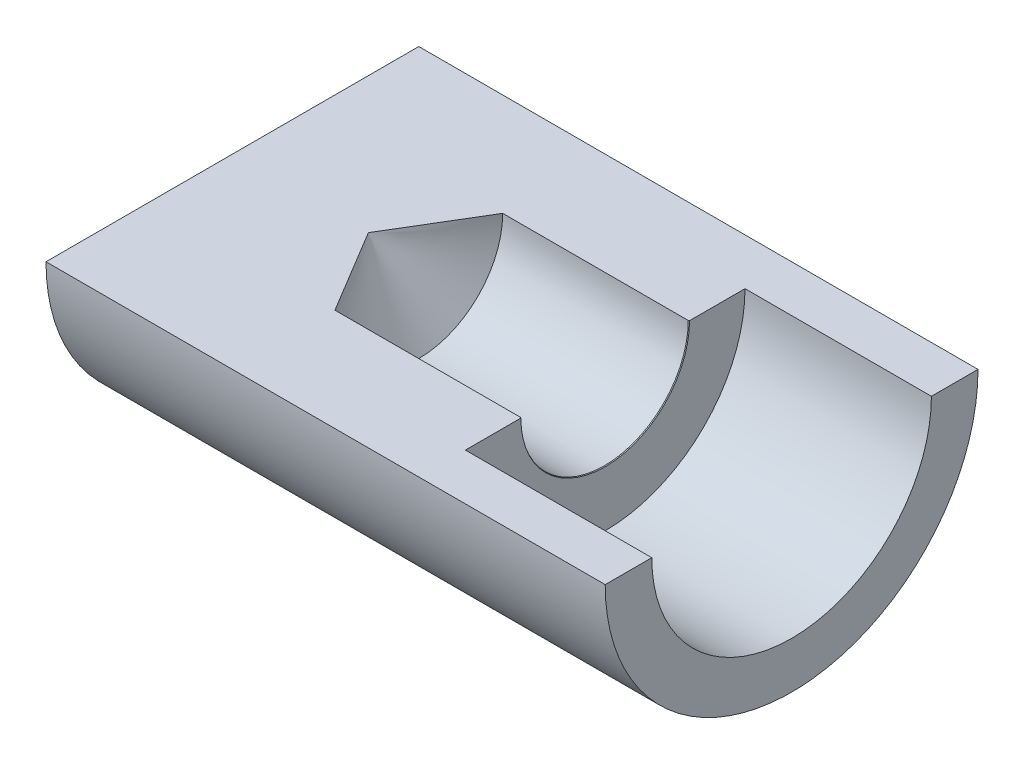
ISO-10303-21;
HEADER;
FILE_DESCRIPTION(('STEP AP214'),'2;1');
FILE_NAME('part.step','',(''),(''),'','','');
FILE_SCHEMA(('AUTOMOTIVE_DESIGN { 1 0 10303 214 1 1 1 1 }'));
ENDSEC;
DATA;
#1=APPLICATION_CONTEXT('core data for automotive mechanical design processes');
#2=APPLICATION_PROTOCOL_DEFINITION('international standard','automotive_design',2000,#1);
#3=PRODUCT_CONTEXT('',#1,'mechanical');
#4=PRODUCT('Part','Part','',(#3));
#5=PRODUCT_RELATED_PRODUCT_CATEGORY('part','',(#4));
#6=PRODUCT_DEFINITION_FORMATION('','',#4);
#7=PRODUCT_DEFINITION_CONTEXT('part definition',#1,'design');
#8=PRODUCT_DEFINITION('design','',#6,#7);
#9=PRODUCT_DEFINITION_SHAPE('','',#8);
#10=(LENGTH_UNIT() NAMED_UNIT(*) SI_UNIT(.MILLI.,.METRE.));
#11=(NAMED_UNIT(*) PLANE_ANGLE_UNIT() SI_UNIT($,.RADIAN.));
#12=(NAMED_UNIT(*) SI_UNIT($,.STERADIAN.) SOLID_ANGLE_UNIT());
#13=UNCERTAINTY_MEASURE_WITH_UNIT(LENGTH_MEASURE(1.E-05),#10,'distance_accuracy_value','');
#14=(GEOMETRIC_REPRESENTATION_CONTEXT(3) GLOBAL_UNCERTAINTY_ASSIGNED_CONTEXT((#13)) GLOBAL_UNIT_ASSIGNED_CONTEXT((#10,
#11,#12)) REPRESENTATION_CONTEXT('',''));
#15=CARTESIAN_POINT('',(0.,0.,0.));
#16=DIRECTION('',(0.,0.,1.));
#17=DIRECTION('',(1.,0.,0.));
#18=AXIS2_PLACEMENT_3D('',#15,#16,#17);
#19=CARTESIAN_POINT('',(0.,0.,0.));
#20=DIRECTION('',(1.,0.,0.));
#21=DIRECTION('',(0.,0.,-1.));
#22=AXIS2_PLACEMENT_3D('',#19,#20,#21);
#23=PLANE('',#22);
#24=CARTESIAN_POINT('',(0.,0.,0.));
#25=DIRECTION('',(-1.,0.,0.));
#26=DIRECTION('',(0.,0.,1.));
#27=AXIS2_PLACEMENT_3D('',#24,#25,#26);
#28=CIRCLE('',#27,10.);
#29=CARTESIAN_POINT('',(0.,0.,-10.));
#30=VERTEX_POINT('',#29);
#31=CARTESIAN_POINT('',(0.,0.,10.));
#32=VERTEX_POINT('',#31);
#33=EDGE_CURVE('E114',#30,#32,#28,.T.);
#34=ORIENTED_EDGE('',*,*,#33,.T.);
#35=DIRECTION('',(0.,0.,-1.));
#36=VECTOR('',#35,1.);
#37=CARTESIAN_POINT('',(0.,0.,16.509129040192));
#38=LINE('',#37,#36);
#39=EDGE_CURVE('E95',#32,#30,#38,.T.);
#40=ORIENTED_EDGE('',*,*,#39,.T.);
#41=EDGE_LOOP('',(#34,#40));
#42=FACE_BOUND('',#41,.T.);
#43=ADVANCED_FACE('F35',(#42),#23,.F.);
#44=CARTESIAN_POINT('',(0.,0.,0.));
#45=DIRECTION('',(-1.,0.,0.));
#46=DIRECTION('',(0.,0.,1.));
#47=AXIS2_PLACEMENT_3D('',#44,#45,#46);
#48=CYLINDRICAL_SURFACE('',#47,10.);
#49=CARTESIAN_POINT('',(30.,0.,0.));
#50=DIRECTION('',(-1.,0.,0.));
#51=DIRECTION('',(0.,0.,1.));
#52=AXIS2_PLACEMENT_3D('',#49,#50,#51);
#53=CIRCLE('',#52,10.);
#54=CARTESIAN_POINT('',(30.,0.,-10.));
#55=VERTEX_POINT('',#54);
#56=CARTESIAN_POINT('',(30.,0.,10.));
#57=VERTEX_POINT('',#56);
#58=EDGE_CURVE('E108',#55,#57,#53,.T.);
#59=ORIENTED_EDGE('',*,*,#58,.T.);
#60=DIRECTION('',(-1.,0.,0.));
#61=VECTOR('',#60,1.);
#62=CARTESIAN_POINT('',(0.,0.,10.));
#63=LINE('',#62,#61);
#64=EDGE_CURVE('E92',#57,#32,#63,.T.);
#65=ORIENTED_EDGE('',*,*,#64,.T.);
#66=ORIENTED_EDGE('',*,*,#33,.F.);
#67=DIRECTION('',(-1.,0.,0.));
#68=VECTOR('',#67,1.);
#69=CARTESIAN_POINT('',(0.,0.,-10.));
#70=LINE('',#69,#68);
#71=EDGE_CURVE('E101',#30,#55,#70,.F.);
#72=ORIENTED_EDGE('',*,*,#71,.T.);
#73=EDGE_LOOP('',(#59,#65,#66,#72));
#74=FACE_BOUND('',#73,.T.);
#75=ADVANCED_FACE('F113',(#74),#48,.T.);
#76=CARTESIAN_POINT('',(30.,10.,0.));
#77=DIRECTION('',(-1.,0.,0.));
#78=DIRECTION('',(0.,0.,1.));
#79=AXIS2_PLACEMENT_3D('',#76,#77,#78);
#80=PLANE('',#79);
#81=ORIENTED_EDGE('',*,*,#58,.F.);
#82=DIRECTION('',(0.,0.,-1.));
#83=VECTOR('',#82,1.);
#84=CARTESIAN_POINT('',(30.,0.,16.509129040192));
#85=LINE('',#84,#83);
#86=CARTESIAN_POINT('',(30.,0.,-7.5));
#87=VERTEX_POINT('',#86);
#88=EDGE_CURVE('E110',#87,#55,#85,.T.);
#89=ORIENTED_EDGE('',*,*,#88,.F.);
#90=CARTESIAN_POINT('',(30.,0.,0.));
#91=DIRECTION('',(1.,0.,0.));
#92=DIRECTION('',(0.,0.,-1.));
#93=AXIS2_PLACEMENT_3D('',#90,#91,#92);
#94=CIRCLE('',#93,7.5);
#95=CARTESIAN_POINT('',(30.,0.,7.5));
#96=VERTEX_POINT('',#95);
#97=EDGE_CURVE('E100',#96,#87,#94,.T.);
#98=ORIENTED_EDGE('',*,*,#97,.F.);
#99=EDGE_CURVE('E49',#57,#96,#85,.T.);
#100=ORIENTED_EDGE('',*,*,#99,.F.);
#101=EDGE_LOOP('',(#81,#89,#98,#100));
#102=FACE_BOUND('',#101,.T.);
#103=ADVANCED_FACE('F106',(#102),#80,.F.);
#104=CARTESIAN_POINT('',(10.,0.,0.));
#105=DIRECTION('',(1.,0.,0.));
#106=DIRECTION('',(0.,0.,-1.));
#107=AXIS2_PLACEMENT_3D('',#104,#105,#106);
#108=CONICAL_SURFACE('',#107,4.5,1.02974425867665);
#109=CARTESIAN_POINT('',(10.,0.,0.));
#110=DIRECTION('',(1.,0.,0.));
#111=DIRECTION('',(0.,0.,-1.));
#112=AXIS2_PLACEMENT_3D('',#109,#110,#111);
#113=CIRCLE('',#112,4.5);
#114=CARTESIAN_POINT('',(10.,0.,4.5));
#115=VERTEX_POINT('',#114);
#116=CARTESIAN_POINT('',(10.,0.,-4.5));
#117=VERTEX_POINT('',#116);
#118=EDGE_CURVE('E115',#115,#117,#113,.T.);
#119=ORIENTED_EDGE('',*,*,#118,.T.);
#120=DIRECTION('',(0.515038074910054,0.,-0.857167300702112));
#121=VECTOR('',#120,1.);
#122=CARTESIAN_POINT('',(7.29612721437598,0.,0.));
#123=LINE('',#122,#121);
#124=CARTESIAN_POINT('',(7.29612721437598,0.,0.));
#125=VERTEX_POINT('',#124);
#126=EDGE_CURVE('E149',#117,#125,#123,.F.);
#127=ORIENTED_EDGE('',*,*,#126,.T.);
#128=DIRECTION('',(-0.515038074910054,0.,-0.857167300702112));
#129=VECTOR('',#128,1.);
#130=CARTESIAN_POINT('',(7.29612721437598,0.,0.));
#131=LINE('',#130,#129);
#132=EDGE_CURVE('E161',#125,#115,#131,.F.);
#133=ORIENTED_EDGE('',*,*,#132,.T.);
#134=EDGE_LOOP('',(#119,#127,#133));
#135=FACE_BOUND('',#134,.T.);
#136=ADVANCED_FACE('F165',(#135),#108,.F.);
#137=CARTESIAN_POINT('',(30.,0.,0.));
#138=DIRECTION('',(1.,0.,0.));
#139=DIRECTION('',(0.,0.,-1.));
#140=AXIS2_PLACEMENT_3D('',#137,#138,#139);
#141=CYLINDRICAL_SURFACE('',#140,4.5);
#142=CARTESIAN_POINT('',(19.9566987298108,0.,0.));
#143=DIRECTION('',(1.,0.,0.));
#144=DIRECTION('',(0.,0.,-1.));
#145=AXIS2_PLACEMENT_3D('',#142,#143,#144);
#146=CIRCLE('',#145,4.5);
#147=CARTESIAN_POINT('',(19.9566987298108,0.,4.5));
#148=VERTEX_POINT('',#147);
#149=CARTESIAN_POINT('',(19.9566987298108,0.,-4.5));
#150=VERTEX_POINT('',#149);
#151=EDGE_CURVE('E119',#148,#150,#146,.T.);
#152=ORIENTED_EDGE('',*,*,#151,.T.);
#153=DIRECTION('',(1.,0.,0.));
#154=VECTOR('',#153,1.);
#155=CARTESIAN_POINT('',(30.,0.,-4.5));
#156=LINE('',#155,#154);
#157=EDGE_CURVE('E143',#150,#117,#156,.F.);
#158=ORIENTED_EDGE('',*,*,#157,.T.);
#159=ORIENTED_EDGE('',*,*,#118,.F.);
#160=DIRECTION('',(1.,0.,0.));
#161=VECTOR('',#160,1.);
#162=CARTESIAN_POINT('',(30.,0.,4.5));
#163=LINE('',#162,#161);
#164=EDGE_CURVE('E137',#115,#148,#163,.T.);
#165=ORIENTED_EDGE('',*,*,#164,.T.);
#166=EDGE_LOOP('',(#152,#158,#159,#165));
#167=FACE_BOUND('',#166,.T.);
#168=ADVANCED_FACE('F157',(#167),#141,.F.);
#169=CARTESIAN_POINT('',(20.,0.,0.));
#170=DIRECTION('',(1.,0.,0.));
#171=DIRECTION('',(0.,0.,-1.));
#172=AXIS2_PLACEMENT_3D('',#169,#170,#171);
#173=CONICAL_SURFACE('',#172,4.525,0.523598775598278);
#174=CARTESIAN_POINT('',(20.,0.,0.));
#175=DIRECTION('',(1.,0.,0.));
#176=DIRECTION('',(0.,0.,-1.));
#177=AXIS2_PLACEMENT_3D('',#174,#175,#176);
#178=CIRCLE('',#177,4.525);
#179=CARTESIAN_POINT('',(20.,0.,4.525));
#180=VERTEX_POINT('',#179);
#181=CARTESIAN_POINT('',(20.,0.,-4.525));
#182=VERTEX_POINT('',#181);
#183=EDGE_CURVE('E134',#180,#182,#178,.T.);
#184=ORIENTED_EDGE('',*,*,#183,.T.);
#185=DIRECTION('',(0.866025403784449,0.,-0.499999999999982));
#186=VECTOR('',#185,1.);
#187=CARTESIAN_POINT('',(12.1624700957505,0.,0.));
#188=LINE('',#187,#186);
#189=EDGE_CURVE('E140',#182,#150,#188,.F.);
#190=ORIENTED_EDGE('',*,*,#189,.T.);
#191=ORIENTED_EDGE('',*,*,#151,.F.);
#192=DIRECTION('',(-0.866025403784449,0.,-0.499999999999982));
#193=VECTOR('',#192,1.);
#194=CARTESIAN_POINT('',(12.1624700957505,0.,0.));
#195=LINE('',#194,#193);
#196=EDGE_CURVE('E135',#148,#180,#195,.F.);
#197=ORIENTED_EDGE('',*,*,#196,.T.);
#198=EDGE_LOOP('',(#184,#190,#191,#197));
#199=FACE_BOUND('',#198,.T.);
#200=ADVANCED_FACE('F159',(#199),#173,.F.);
#201=CARTESIAN_POINT('',(20.,4.525,0.));
#202=DIRECTION('',(-1.,0.,0.));
#203=DIRECTION('',(0.,0.,1.));
#204=AXIS2_PLACEMENT_3D('',#201,#202,#203);
#205=PLANE('',#204);
#206=CARTESIAN_POINT('',(20.,0.,0.));
#207=DIRECTION('',(1.,0.,0.));
#208=DIRECTION('',(0.,0.,-1.));
#209=AXIS2_PLACEMENT_3D('',#206,#207,#208);
#210=CIRCLE('',#209,7.5);
#211=CARTESIAN_POINT('',(20.,0.,7.5));
#212=VERTEX_POINT('',#211);
#213=CARTESIAN_POINT('',(20.,0.,-7.5));
#214=VERTEX_POINT('',#213);
#215=EDGE_CURVE('E126',#212,#214,#210,.T.);
#216=ORIENTED_EDGE('',*,*,#215,.T.);
#217=DIRECTION('',(0.,0.,1.));
#218=VECTOR('',#217,1.);
#219=CARTESIAN_POINT('',(20.,0.,0.));
#220=LINE('',#219,#218);
#221=EDGE_CURVE('E56',#214,#182,#220,.T.);
#222=ORIENTED_EDGE('',*,*,#221,.T.);
#223=ORIENTED_EDGE('',*,*,#183,.F.);
#224=EDGE_CURVE('E128',#180,#212,#220,.T.);
#225=ORIENTED_EDGE('',*,*,#224,.T.);
#226=EDGE_LOOP('',(#216,#222,#223,#225));
#227=FACE_BOUND('',#226,.T.);
#228=ADVANCED_FACE('F132',(#227),#205,.F.);
#229=CARTESIAN_POINT('',(30.,0.,0.));
#230=DIRECTION('',(1.,0.,0.));
#231=DIRECTION('',(0.,0.,-1.));
#232=AXIS2_PLACEMENT_3D('',#229,#230,#231);
#233=CYLINDRICAL_SURFACE('',#232,7.5);
#234=ORIENTED_EDGE('',*,*,#97,.T.);
#235=DIRECTION('',(1.,0.,0.));
#236=VECTOR('',#235,1.);
#237=CARTESIAN_POINT('',(30.,0.,-7.5));
#238=LINE('',#237,#236);
#239=EDGE_CURVE('E11',#87,#214,#238,.F.);
#240=ORIENTED_EDGE('',*,*,#239,.T.);
#241=ORIENTED_EDGE('',*,*,#215,.F.);
#242=DIRECTION('',(1.,0.,0.));
#243=VECTOR('',#242,1.);
#244=CARTESIAN_POINT('',(30.,0.,7.5));
#245=LINE('',#244,#243);
#246=EDGE_CURVE('E42',#212,#96,#245,.T.);
#247=ORIENTED_EDGE('',*,*,#246,.T.);
#248=EDGE_LOOP('',(#234,#240,#241,#247));
#249=FACE_BOUND('',#248,.T.);
#250=ADVANCED_FACE('F124',(#249),#233,.F.);
#251=CARTESIAN_POINT('',(0.,0.,16.509129040192));
#252=DIRECTION('',(0.,-1.,0.));
#253=DIRECTION('',(0.,0.,-1.));
#254=AXIS2_PLACEMENT_3D('',#251,#252,#253);
#255=PLANE('',#254);
#256=ORIENTED_EDGE('',*,*,#99,.T.);
#257=ORIENTED_EDGE('',*,*,#246,.F.);
#258=ORIENTED_EDGE('',*,*,#224,.F.);
#259=ORIENTED_EDGE('',*,*,#196,.F.);
#260=ORIENTED_EDGE('',*,*,#164,.F.);
#261=ORIENTED_EDGE('',*,*,#132,.F.);
#262=ORIENTED_EDGE('',*,*,#126,.F.);
#263=ORIENTED_EDGE('',*,*,#157,.F.);
#264=ORIENTED_EDGE('',*,*,#189,.F.);
#265=ORIENTED_EDGE('',*,*,#221,.F.);
#266=ORIENTED_EDGE('',*,*,#239,.F.);
#267=ORIENTED_EDGE('',*,*,#88,.T.);
#268=ORIENTED_EDGE('',*,*,#71,.F.);
#269=ORIENTED_EDGE('',*,*,#39,.F.);
#270=ORIENTED_EDGE('',*,*,#64,.F.);
#271=EDGE_LOOP('',(#256,#257,#258,#259,#260,#261,#262,#263,#264,#265,#266,#267,#268,#269,#270));
#272=FACE_BOUND('',#271,.T.);
#273=ADVANCED_FACE('F93',(#272),#255,.F.);
#274=CLOSED_SHELL('',(#43,#75,#103,#136,#168,#200,#228,#250,#273));
#275=MANIFOLD_SOLID_BREP('B2',#274);
#276=ADVANCED_BREP_SHAPE_REPRESENTATION('',(#18,#275),#14);
#277=SHAPE_DEFINITION_REPRESENTATION(#9,#276);
ENDSEC;
END-ISO-10303-21;
